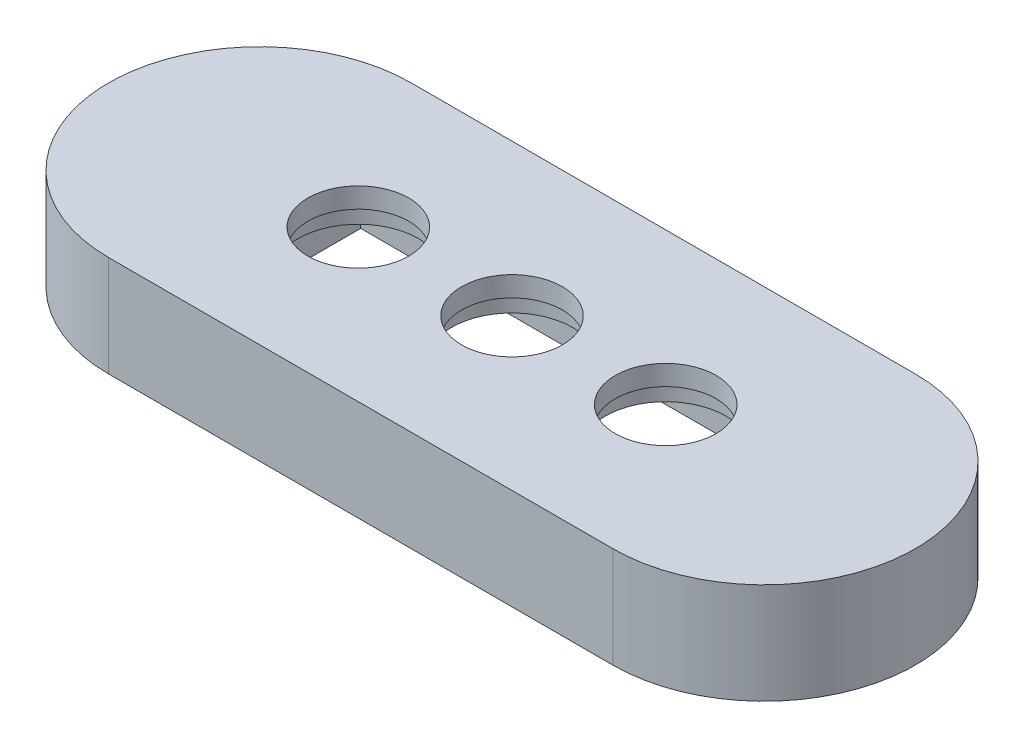
ISO-10303-21;
HEADER;
FILE_DESCRIPTION(('STEP AP214'),'2;1');
FILE_NAME('part.step','',(''),(''),'','','');
FILE_SCHEMA(('AUTOMOTIVE_DESIGN { 1 0 10303 214 1 1 1 1 }'));
ENDSEC;
DATA;
#1=APPLICATION_CONTEXT('core data for automotive mechanical design processes');
#2=APPLICATION_PROTOCOL_DEFINITION('international standard','automotive_design',2000,#1);
#3=PRODUCT_CONTEXT('',#1,'mechanical');
#4=PRODUCT('Part','Part','',(#3));
#5=PRODUCT_RELATED_PRODUCT_CATEGORY('part','',(#4));
#6=PRODUCT_DEFINITION_FORMATION('','',#4);
#7=PRODUCT_DEFINITION_CONTEXT('part definition',#1,'design');
#8=PRODUCT_DEFINITION('design','',#6,#7);
#9=PRODUCT_DEFINITION_SHAPE('','',#8);
#10=(LENGTH_UNIT() NAMED_UNIT(*) SI_UNIT(.MILLI.,.METRE.));
#11=(NAMED_UNIT(*) PLANE_ANGLE_UNIT() SI_UNIT($,.RADIAN.));
#12=(NAMED_UNIT(*) SI_UNIT($,.STERADIAN.) SOLID_ANGLE_UNIT());
#13=UNCERTAINTY_MEASURE_WITH_UNIT(LENGTH_MEASURE(1.E-05),#10,'distance_accuracy_value','');
#14=(GEOMETRIC_REPRESENTATION_CONTEXT(3) GLOBAL_UNCERTAINTY_ASSIGNED_CONTEXT((#13)) GLOBAL_UNIT_ASSIGNED_CONTEXT((#10,
#11,#12)) REPRESENTATION_CONTEXT('',''));
#15=CARTESIAN_POINT('',(0.,0.,0.));
#16=DIRECTION('',(0.,0.,1.));
#17=DIRECTION('',(1.,0.,0.));
#18=AXIS2_PLACEMENT_3D('',#15,#16,#17);
#19=CARTESIAN_POINT('',(0.,-3.,0.));
#20=DIRECTION('',(0.,1.,0.));
#21=DIRECTION('',(0.,0.,1.));
#22=AXIS2_PLACEMENT_3D('',#19,#20,#21);
#23=PLANE('',#22);
#24=DIRECTION('',(0.,0.,-1.));
#25=VECTOR('',#24,1.);
#26=CARTESIAN_POINT('',(0.,-3.,5.));
#27=LINE('',#26,#25);
#28=CARTESIAN_POINT('',(0.,-3.,5.));
#29=VERTEX_POINT('',#28);
#30=CARTESIAN_POINT('',(0.,-3.,-5.));
#31=VERTEX_POINT('',#30);
#32=EDGE_CURVE('E44',#29,#31,#27,.T.);
#33=ORIENTED_EDGE('',*,*,#32,.T.);
#34=DIRECTION('',(-1.,0.,0.));
#35=VECTOR('',#34,1.);
#36=CARTESIAN_POINT('',(-25.,-3.,-5.));
#37=LINE('',#36,#35);
#38=CARTESIAN_POINT('',(-25.,-3.,-5.));
#39=VERTEX_POINT('',#38);
#40=EDGE_CURVE('E11',#31,#39,#37,.T.);
#41=ORIENTED_EDGE('',*,*,#40,.T.);
#42=DIRECTION('',(0.,0.,1.));
#43=VECTOR('',#42,1.);
#44=CARTESIAN_POINT('',(-25.,-3.,5.));
#45=LINE('',#44,#43);
#46=CARTESIAN_POINT('',(-25.,-3.,5.));
#47=VERTEX_POINT('',#46);
#48=EDGE_CURVE('E49',#39,#47,#45,.T.);
#49=ORIENTED_EDGE('',*,*,#48,.T.);
#50=DIRECTION('',(1.,0.,0.));
#51=VECTOR('',#50,1.);
#52=CARTESIAN_POINT('',(-25.,-3.,5.));
#53=LINE('',#52,#51);
#54=EDGE_CURVE('E208',#47,#29,#53,.T.);
#55=ORIENTED_EDGE('',*,*,#54,.T.);
#56=EDGE_LOOP('',(#33,#41,#49,#55));
#57=FACE_BOUND('',#56,.T.);
#58=CARTESIAN_POINT('',(0.,-3.,0.));
#59=DIRECTION('',(0.,1.,0.));
#60=DIRECTION('',(0.,0.,1.));
#61=AXIS2_PLACEMENT_3D('',#58,#59,#60);
#62=CIRCLE('',#61,7.5);
#63=CARTESIAN_POINT('',(0.,-3.,7.5));
#64=VERTEX_POINT('',#63);
#65=CARTESIAN_POINT('',(0.,-3.,-7.5));
#66=VERTEX_POINT('',#65);
#67=EDGE_CURVE('E204',#64,#66,#62,.T.);
#68=ORIENTED_EDGE('',*,*,#67,.F.);
#69=DIRECTION('',(1.,0.,0.));
#70=VECTOR('',#69,1.);
#71=CARTESIAN_POINT('',(0.,-3.,7.5));
#72=LINE('',#71,#70);
#73=CARTESIAN_POINT('',(-25.,-3.,7.5));
#74=VERTEX_POINT('',#73);
#75=EDGE_CURVE('E194',#74,#64,#72,.T.);
#76=ORIENTED_EDGE('',*,*,#75,.F.);
#77=CARTESIAN_POINT('',(-25.,-3.,0.));
#78=DIRECTION('',(0.,1.,0.));
#79=DIRECTION('',(0.,0.,1.));
#80=AXIS2_PLACEMENT_3D('',#77,#78,#79);
#81=CIRCLE('',#80,7.5);
#82=CARTESIAN_POINT('',(-25.,-3.,-7.5));
#83=VERTEX_POINT('',#82);
#84=EDGE_CURVE('E197',#83,#74,#81,.T.);
#85=ORIENTED_EDGE('',*,*,#84,.F.);
#86=DIRECTION('',(-1.,0.,0.));
#87=VECTOR('',#86,1.);
#88=CARTESIAN_POINT('',(0.,-3.,-7.5));
#89=LINE('',#88,#87);
#90=EDGE_CURVE('E200',#66,#83,#89,.T.);
#91=ORIENTED_EDGE('',*,*,#90,.F.);
#92=EDGE_LOOP('',(#68,#76,#85,#91));
#93=FACE_BOUND('',#92,.T.);
#94=ADVANCED_FACE('F41',(#57,#93),#23,.F.);
#95=CARTESIAN_POINT('',(0.,2.,0.));
#96=DIRECTION('',(0.,-1.,0.));
#97=DIRECTION('',(0.,0.,-1.));
#98=AXIS2_PLACEMENT_3D('',#95,#96,#97);
#99=CYLINDRICAL_SURFACE('',#98,7.5);
#100=DIRECTION('',(0.,-1.,0.));
#101=VECTOR('',#100,1.);
#102=CARTESIAN_POINT('',(0.,2.,7.5));
#103=LINE('',#102,#101);
#104=CARTESIAN_POINT('',(0.,2.,7.5));
#105=VERTEX_POINT('',#104);
#106=EDGE_CURVE('E182',#105,#64,#103,.T.);
#107=ORIENTED_EDGE('',*,*,#106,.T.);
#108=ORIENTED_EDGE('',*,*,#67,.T.);
#109=DIRECTION('',(0.,-1.,0.));
#110=VECTOR('',#109,1.);
#111=CARTESIAN_POINT('',(0.,2.,-7.5));
#112=LINE('',#111,#110);
#113=CARTESIAN_POINT('',(0.,2.,-7.5));
#114=VERTEX_POINT('',#113);
#115=EDGE_CURVE('E191',#114,#66,#112,.T.);
#116=ORIENTED_EDGE('',*,*,#115,.F.);
#117=CARTESIAN_POINT('',(0.,2.,0.));
#118=DIRECTION('',(0.,1.,0.));
#119=DIRECTION('',(0.,0.,1.));
#120=AXIS2_PLACEMENT_3D('',#117,#118,#119);
#121=CIRCLE('',#120,7.5);
#122=EDGE_CURVE('E173',#105,#114,#121,.T.);
#123=ORIENTED_EDGE('',*,*,#122,.F.);
#124=EDGE_LOOP('',(#107,#108,#116,#123));
#125=FACE_BOUND('',#124,.T.);
#126=ADVANCED_FACE('F223',(#125),#99,.T.);
#127=CARTESIAN_POINT('',(0.,2.,-7.5));
#128=DIRECTION('',(0.,0.,1.));
#129=DIRECTION('',(1.,0.,0.));
#130=AXIS2_PLACEMENT_3D('',#127,#128,#129);
#131=PLANE('',#130);
#132=ORIENTED_EDGE('',*,*,#115,.T.);
#133=ORIENTED_EDGE('',*,*,#90,.T.);
#134=DIRECTION('',(0.,-1.,0.));
#135=VECTOR('',#134,1.);
#136=CARTESIAN_POINT('',(-25.,2.,-7.5));
#137=LINE('',#136,#135);
#138=CARTESIAN_POINT('',(-25.,2.,-7.5));
#139=VERTEX_POINT('',#138);
#140=EDGE_CURVE('E188',#139,#83,#137,.T.);
#141=ORIENTED_EDGE('',*,*,#140,.F.);
#142=DIRECTION('',(-1.,0.,0.));
#143=VECTOR('',#142,1.);
#144=CARTESIAN_POINT('',(0.,2.,-7.5));
#145=LINE('',#144,#143);
#146=EDGE_CURVE('E176',#114,#139,#145,.T.);
#147=ORIENTED_EDGE('',*,*,#146,.F.);
#148=EDGE_LOOP('',(#132,#133,#141,#147));
#149=FACE_BOUND('',#148,.T.);
#150=ADVANCED_FACE('F229',(#149),#131,.F.);
#151=CARTESIAN_POINT('',(-25.,2.,0.));
#152=DIRECTION('',(0.,-1.,0.));
#153=DIRECTION('',(0.,0.,-1.));
#154=AXIS2_PLACEMENT_3D('',#151,#152,#153);
#155=CYLINDRICAL_SURFACE('',#154,7.5);
#156=ORIENTED_EDGE('',*,*,#140,.T.);
#157=ORIENTED_EDGE('',*,*,#84,.T.);
#158=DIRECTION('',(0.,-1.,0.));
#159=VECTOR('',#158,1.);
#160=CARTESIAN_POINT('',(-25.,2.,7.5));
#161=LINE('',#160,#159);
#162=CARTESIAN_POINT('',(-25.,2.,7.5));
#163=VERTEX_POINT('',#162);
#164=EDGE_CURVE('E185',#163,#74,#161,.T.);
#165=ORIENTED_EDGE('',*,*,#164,.F.);
#166=CARTESIAN_POINT('',(-25.,2.,0.));
#167=DIRECTION('',(0.,1.,0.));
#168=DIRECTION('',(0.,0.,1.));
#169=AXIS2_PLACEMENT_3D('',#166,#167,#168);
#170=CIRCLE('',#169,7.5);
#171=EDGE_CURVE('E178',#139,#163,#170,.T.);
#172=ORIENTED_EDGE('',*,*,#171,.F.);
#173=EDGE_LOOP('',(#156,#157,#165,#172));
#174=FACE_BOUND('',#173,.T.);
#175=ADVANCED_FACE('F275',(#174),#155,.T.);
#176=CARTESIAN_POINT('',(0.,2.,7.5));
#177=DIRECTION('',(0.,0.,-1.));
#178=DIRECTION('',(-1.,0.,0.));
#179=AXIS2_PLACEMENT_3D('',#176,#177,#178);
#180=PLANE('',#179);
#181=ORIENTED_EDGE('',*,*,#164,.T.);
#182=ORIENTED_EDGE('',*,*,#75,.T.);
#183=ORIENTED_EDGE('',*,*,#106,.F.);
#184=DIRECTION('',(1.,0.,0.));
#185=VECTOR('',#184,1.);
#186=CARTESIAN_POINT('',(0.,2.,7.5));
#187=LINE('',#186,#185);
#188=EDGE_CURVE('E180',#163,#105,#187,.T.);
#189=ORIENTED_EDGE('',*,*,#188,.F.);
#190=EDGE_LOOP('',(#181,#182,#183,#189));
#191=FACE_BOUND('',#190,.T.);
#192=ADVANCED_FACE('F272',(#191),#180,.F.);
#193=CARTESIAN_POINT('',(0.,-30.,5.));
#194=DIRECTION('',(-1.,0.,0.));
#195=DIRECTION('',(0.,0.,1.));
#196=AXIS2_PLACEMENT_3D('',#193,#194,#195);
#197=PLANE('',#196);
#198=ORIENTED_EDGE('',*,*,#32,.F.);
#199=DIRECTION('',(0.,1.,0.));
#200=VECTOR('',#199,1.);
#201=CARTESIAN_POINT('',(0.,-30.,5.));
#202=LINE('',#201,#200);
#203=CARTESIAN_POINT('',(0.,0.,5.));
#204=VERTEX_POINT('',#203);
#205=EDGE_CURVE('E106',#29,#204,#202,.T.);
#206=ORIENTED_EDGE('',*,*,#205,.T.);
#207=DIRECTION('',(0.,0.,1.));
#208=VECTOR('',#207,1.);
#209=CARTESIAN_POINT('',(0.,0.,5.));
#210=LINE('',#209,#208);
#211=CARTESIAN_POINT('',(0.,0.,-5.));
#212=VERTEX_POINT('',#211);
#213=EDGE_CURVE('E111',#212,#204,#210,.T.);
#214=ORIENTED_EDGE('',*,*,#213,.F.);
#215=DIRECTION('',(0.,1.,0.));
#216=VECTOR('',#215,1.);
#217=CARTESIAN_POINT('',(0.,-30.,-5.));
#218=LINE('',#217,#216);
#219=EDGE_CURVE('E133',#31,#212,#218,.T.);
#220=ORIENTED_EDGE('',*,*,#219,.F.);
#221=EDGE_LOOP('',(#198,#206,#214,#220));
#222=FACE_BOUND('',#221,.T.);
#223=ADVANCED_FACE('F108',(#222),#197,.T.);
#224=CARTESIAN_POINT('',(-25.,-30.,5.));
#225=DIRECTION('',(0.,0.,-1.));
#226=DIRECTION('',(-1.,0.,0.));
#227=AXIS2_PLACEMENT_3D('',#224,#225,#226);
#228=PLANE('',#227);
#229=ORIENTED_EDGE('',*,*,#54,.F.);
#230=DIRECTION('',(0.,1.,0.));
#231=VECTOR('',#230,1.);
#232=CARTESIAN_POINT('',(-25.,-30.,5.));
#233=LINE('',#232,#231);
#234=CARTESIAN_POINT('',(-25.,0.,5.));
#235=VERTEX_POINT('',#234);
#236=EDGE_CURVE('E115',#47,#235,#233,.T.);
#237=ORIENTED_EDGE('',*,*,#236,.T.);
#238=DIRECTION('',(-1.,0.,0.));
#239=VECTOR('',#238,1.);
#240=CARTESIAN_POINT('',(-25.,0.,5.));
#241=LINE('',#240,#239);
#242=EDGE_CURVE('E118',#204,#235,#241,.T.);
#243=ORIENTED_EDGE('',*,*,#242,.F.);
#244=ORIENTED_EDGE('',*,*,#205,.F.);
#245=EDGE_LOOP('',(#229,#237,#243,#244));
#246=FACE_BOUND('',#245,.T.);
#247=ADVANCED_FACE('F119',(#246),#228,.T.);
#248=CARTESIAN_POINT('',(-25.,-30.,5.));
#249=DIRECTION('',(1.,0.,0.));
#250=DIRECTION('',(0.,0.,-1.));
#251=AXIS2_PLACEMENT_3D('',#248,#249,#250);
#252=PLANE('',#251);
#253=ORIENTED_EDGE('',*,*,#48,.F.);
#254=DIRECTION('',(0.,1.,0.));
#255=VECTOR('',#254,1.);
#256=CARTESIAN_POINT('',(-25.,-30.,-5.));
#257=LINE('',#256,#255);
#258=CARTESIAN_POINT('',(-25.,0.,-5.));
#259=VERTEX_POINT('',#258);
#260=EDGE_CURVE('E135',#39,#259,#257,.T.);
#261=ORIENTED_EDGE('',*,*,#260,.T.);
#262=DIRECTION('',(0.,0.,-1.));
#263=VECTOR('',#262,1.);
#264=CARTESIAN_POINT('',(-25.,0.,5.));
#265=LINE('',#264,#263);
#266=EDGE_CURVE('E123',#235,#259,#265,.T.);
#267=ORIENTED_EDGE('',*,*,#266,.F.);
#268=ORIENTED_EDGE('',*,*,#236,.F.);
#269=EDGE_LOOP('',(#253,#261,#267,#268));
#270=FACE_BOUND('',#269,.T.);
#271=ADVANCED_FACE('F212',(#270),#252,.T.);
#272=CARTESIAN_POINT('',(-25.,-30.,-5.));
#273=DIRECTION('',(0.,0.,1.));
#274=DIRECTION('',(1.,0.,0.));
#275=AXIS2_PLACEMENT_3D('',#272,#273,#274);
#276=PLANE('',#275);
#277=ORIENTED_EDGE('',*,*,#40,.F.);
#278=ORIENTED_EDGE('',*,*,#219,.T.);
#279=DIRECTION('',(1.,0.,0.));
#280=VECTOR('',#279,1.);
#281=CARTESIAN_POINT('',(-25.,0.,-5.));
#282=LINE('',#281,#280);
#283=EDGE_CURVE('E128',#259,#212,#282,.T.);
#284=ORIENTED_EDGE('',*,*,#283,.F.);
#285=ORIENTED_EDGE('',*,*,#260,.F.);
#286=EDGE_LOOP('',(#277,#278,#284,#285));
#287=FACE_BOUND('',#286,.T.);
#288=ADVANCED_FACE('F211',(#287),#276,.T.);
#289=CARTESIAN_POINT('',(-12.5,2.,0.));
#290=DIRECTION('',(0.,-1.,0.));
#291=DIRECTION('',(0.,0.,-1.));
#292=AXIS2_PLACEMENT_3D('',#289,#290,#291);
#293=CYLINDRICAL_SURFACE('',#292,2.5);
#294=CARTESIAN_POINT('',(-12.5,2.,0.));
#295=DIRECTION('',(0.,1.,0.));
#296=DIRECTION('',(0.,0.,1.));
#297=AXIS2_PLACEMENT_3D('',#294,#295,#296);
#298=CIRCLE('',#297,2.5);
#299=CARTESIAN_POINT('',(-12.5,2.,2.5));
#300=VERTEX_POINT('',#299);
#301=EDGE_CURVE('E170',#300,#300,#298,.T.);
#302=ORIENTED_EDGE('',*,*,#301,.T.);
#303=EDGE_LOOP('',(#302));
#304=FACE_BOUND('',#303,.T.);
#305=CARTESIAN_POINT('',(-12.5,1.,0.));
#306=DIRECTION('',(0.,-1.,0.));
#307=DIRECTION('',(0.,0.,-1.));
#308=AXIS2_PLACEMENT_3D('',#305,#306,#307);
#309=CIRCLE('',#308,2.5);
#310=CARTESIAN_POINT('',(-12.5,1.,-2.5));
#311=VERTEX_POINT('',#310);
#312=EDGE_CURVE('E142',#311,#311,#309,.T.);
#313=ORIENTED_EDGE('',*,*,#312,.T.);
#314=EDGE_LOOP('',(#313));
#315=FACE_BOUND('',#314,.T.);
#316=ADVANCED_FACE('F219',(#304,#315),#293,.F.);
#317=CARTESIAN_POINT('',(-20.12,2.,0.));
#318=DIRECTION('',(0.,-1.,0.));
#319=DIRECTION('',(0.,0.,-1.));
#320=AXIS2_PLACEMENT_3D('',#317,#318,#319);
#321=CYLINDRICAL_SURFACE('',#320,2.5);
#322=CARTESIAN_POINT('',(-20.12,2.,0.));
#323=DIRECTION('',(0.,1.,0.));
#324=DIRECTION('',(0.,0.,1.));
#325=AXIS2_PLACEMENT_3D('',#322,#323,#324);
#326=CIRCLE('',#325,2.5);
#327=CARTESIAN_POINT('',(-20.12,2.,2.5));
#328=VERTEX_POINT('',#327);
#329=EDGE_CURVE('E167',#328,#328,#326,.T.);
#330=ORIENTED_EDGE('',*,*,#329,.T.);
#331=EDGE_LOOP('',(#330));
#332=FACE_BOUND('',#331,.T.);
#333=CARTESIAN_POINT('',(-20.12,1.,0.));
#334=DIRECTION('',(0.,-1.,0.));
#335=DIRECTION('',(0.,0.,-1.));
#336=AXIS2_PLACEMENT_3D('',#333,#334,#335);
#337=CIRCLE('',#336,2.5);
#338=CARTESIAN_POINT('',(-20.12,1.,-2.5));
#339=VERTEX_POINT('',#338);
#340=EDGE_CURVE('E138',#339,#339,#337,.T.);
#341=ORIENTED_EDGE('',*,*,#340,.T.);
#342=EDGE_LOOP('',(#341));
#343=FACE_BOUND('',#342,.T.);
#344=ADVANCED_FACE('F259',(#332,#343),#321,.F.);
#345=CARTESIAN_POINT('',(-4.88,2.,0.));
#346=DIRECTION('',(0.,-1.,0.));
#347=DIRECTION('',(0.,0.,-1.));
#348=AXIS2_PLACEMENT_3D('',#345,#346,#347);
#349=CYLINDRICAL_SURFACE('',#348,2.5);
#350=CARTESIAN_POINT('',(-4.88,2.,0.));
#351=DIRECTION('',(0.,1.,0.));
#352=DIRECTION('',(0.,0.,-1.));
#353=AXIS2_PLACEMENT_3D('',#350,#351,#352);
#354=CIRCLE('',#353,2.5);
#355=CARTESIAN_POINT('',(-4.88,2.,-2.5));
#356=VERTEX_POINT('',#355);
#357=EDGE_CURVE('E146',#356,#356,#354,.T.);
#358=ORIENTED_EDGE('',*,*,#357,.T.);
#359=EDGE_LOOP('',(#358));
#360=FACE_BOUND('',#359,.T.);
#361=CARTESIAN_POINT('',(-4.88,1.,0.));
#362=DIRECTION('',(0.,-1.,0.));
#363=DIRECTION('',(0.,0.,-1.));
#364=AXIS2_PLACEMENT_3D('',#361,#362,#363);
#365=CIRCLE('',#364,2.5);
#366=CARTESIAN_POINT('',(-4.88,1.,-2.5));
#367=VERTEX_POINT('',#366);
#368=EDGE_CURVE('E155',#367,#367,#365,.T.);
#369=ORIENTED_EDGE('',*,*,#368,.T.);
#370=EDGE_LOOP('',(#369));
#371=FACE_BOUND('',#370,.T.);
#372=ADVANCED_FACE('F255',(#360,#371),#349,.F.);
#373=CARTESIAN_POINT('',(0.,2.,0.));
#374=DIRECTION('',(0.,1.,0.));
#375=DIRECTION('',(0.,0.,1.));
#376=AXIS2_PLACEMENT_3D('',#373,#374,#375);
#377=PLANE('',#376);
#378=ORIENTED_EDGE('',*,*,#329,.F.);
#379=EDGE_LOOP('',(#378));
#380=FACE_BOUND('',#379,.T.);
#381=ORIENTED_EDGE('',*,*,#122,.T.);
#382=ORIENTED_EDGE('',*,*,#146,.T.);
#383=ORIENTED_EDGE('',*,*,#171,.T.);
#384=ORIENTED_EDGE('',*,*,#188,.T.);
#385=EDGE_LOOP('',(#381,#382,#383,#384));
#386=FACE_BOUND('',#385,.T.);
#387=ORIENTED_EDGE('',*,*,#301,.F.);
#388=EDGE_LOOP('',(#387));
#389=FACE_BOUND('',#388,.T.);
#390=ORIENTED_EDGE('',*,*,#357,.F.);
#391=EDGE_LOOP('',(#390));
#392=FACE_BOUND('',#391,.T.);
#393=ADVANCED_FACE('F258',(#380,#386,#389,#392),#377,.T.);
#394=CARTESIAN_POINT('',(0.,0.,0.));
#395=DIRECTION('',(0.,1.,0.));
#396=DIRECTION('',(0.,0.,1.));
#397=AXIS2_PLACEMENT_3D('',#394,#395,#396);
#398=PLANE('',#397);
#399=ORIENTED_EDGE('',*,*,#283,.T.);
#400=ORIENTED_EDGE('',*,*,#213,.T.);
#401=ORIENTED_EDGE('',*,*,#242,.T.);
#402=ORIENTED_EDGE('',*,*,#266,.T.);
#403=EDGE_LOOP('',(#399,#400,#401,#402));
#404=FACE_BOUND('',#403,.T.);
#405=CARTESIAN_POINT('',(-20.12,0.,0.));
#406=DIRECTION('',(0.,-1.,0.));
#407=DIRECTION('',(0.,0.,-1.));
#408=AXIS2_PLACEMENT_3D('',#405,#406,#407);
#409=CIRCLE('',#408,3.);
#410=CARTESIAN_POINT('',(-20.12,0.,-3.));
#411=VERTEX_POINT('',#410);
#412=EDGE_CURVE('E141',#411,#411,#409,.T.);
#413=ORIENTED_EDGE('',*,*,#412,.F.);
#414=EDGE_LOOP('',(#413));
#415=FACE_BOUND('',#414,.T.);
#416=CARTESIAN_POINT('',(-12.5,0.,0.));
#417=DIRECTION('',(0.,-1.,0.));
#418=DIRECTION('',(0.,0.,-1.));
#419=AXIS2_PLACEMENT_3D('',#416,#417,#418);
#420=CIRCLE('',#419,3.);
#421=CARTESIAN_POINT('',(-12.5,0.,-3.));
#422=VERTEX_POINT('',#421);
#423=EDGE_CURVE('E149',#422,#422,#420,.T.);
#424=ORIENTED_EDGE('',*,*,#423,.F.);
#425=EDGE_LOOP('',(#424));
#426=FACE_BOUND('',#425,.T.);
#427=CARTESIAN_POINT('',(-4.88,0.,0.));
#428=DIRECTION('',(0.,-1.,0.));
#429=DIRECTION('',(0.,0.,-1.));
#430=AXIS2_PLACEMENT_3D('',#427,#428,#429);
#431=CIRCLE('',#430,3.);
#432=CARTESIAN_POINT('',(-4.88,0.,-3.));
#433=VERTEX_POINT('',#432);
#434=EDGE_CURVE('E158',#433,#433,#431,.T.);
#435=ORIENTED_EDGE('',*,*,#434,.F.);
#436=EDGE_LOOP('',(#435));
#437=FACE_BOUND('',#436,.T.);
#438=ADVANCED_FACE('F125',(#404,#415,#426,#437),#398,.F.);
#439=CARTESIAN_POINT('',(-4.88,1.,0.));
#440=DIRECTION('',(0.,-1.,0.));
#441=DIRECTION('',(0.,0.,-1.));
#442=AXIS2_PLACEMENT_3D('',#439,#440,#441);
#443=CYLINDRICAL_SURFACE('',#442,3.);
#444=CARTESIAN_POINT('',(-4.88,1.,0.));
#445=DIRECTION('',(0.,-1.,0.));
#446=DIRECTION('',(0.,0.,-1.));
#447=AXIS2_PLACEMENT_3D('',#444,#445,#446);
#448=CIRCLE('',#447,3.);
#449=CARTESIAN_POINT('',(-4.88,1.,-3.));
#450=VERTEX_POINT('',#449);
#451=EDGE_CURVE('E114',#450,#450,#448,.T.);
#452=ORIENTED_EDGE('',*,*,#451,.F.);
#453=EDGE_LOOP('',(#452));
#454=FACE_BOUND('',#453,.T.);
#455=ORIENTED_EDGE('',*,*,#434,.T.);
#456=EDGE_LOOP('',(#455));
#457=FACE_BOUND('',#456,.T.);
#458=ADVANCED_FACE('F246',(#454,#457),#443,.F.);
#459=CARTESIAN_POINT('',(-4.88,1.,0.));
#460=DIRECTION('',(0.,-1.,0.));
#461=DIRECTION('',(0.,0.,-1.));
#462=AXIS2_PLACEMENT_3D('',#459,#460,#461);
#463=PLANE('',#462);
#464=ORIENTED_EDGE('',*,*,#368,.F.);
#465=EDGE_LOOP('',(#464));
#466=FACE_BOUND('',#465,.T.);
#467=ORIENTED_EDGE('',*,*,#451,.T.);
#468=EDGE_LOOP('',(#467));
#469=FACE_BOUND('',#468,.T.);
#470=ADVANCED_FACE('F249',(#466,#469),#463,.T.);
#471=CARTESIAN_POINT('',(-20.12,1.,0.));
#472=DIRECTION('',(0.,-1.,0.));
#473=DIRECTION('',(0.,0.,-1.));
#474=AXIS2_PLACEMENT_3D('',#471,#472,#473);
#475=CYLINDRICAL_SURFACE('',#474,3.);
#476=CARTESIAN_POINT('',(-20.12,1.,0.));
#477=DIRECTION('',(0.,-1.,0.));
#478=DIRECTION('',(0.,0.,-1.));
#479=AXIS2_PLACEMENT_3D('',#476,#477,#478);
#480=CIRCLE('',#479,3.);
#481=CARTESIAN_POINT('',(-20.12,1.,-3.));
#482=VERTEX_POINT('',#481);
#483=EDGE_CURVE('E143',#482,#482,#480,.T.);
#484=ORIENTED_EDGE('',*,*,#483,.F.);
#485=EDGE_LOOP('',(#484));
#486=FACE_BOUND('',#485,.T.);
#487=ORIENTED_EDGE('',*,*,#412,.T.);
#488=EDGE_LOOP('',(#487));
#489=FACE_BOUND('',#488,.T.);
#490=ADVANCED_FACE('F253',(#486,#489),#475,.F.);
#491=CARTESIAN_POINT('',(-20.12,1.,0.));
#492=DIRECTION('',(0.,-1.,0.));
#493=DIRECTION('',(0.,0.,-1.));
#494=AXIS2_PLACEMENT_3D('',#491,#492,#493);
#495=PLANE('',#494);
#496=ORIENTED_EDGE('',*,*,#340,.F.);
#497=EDGE_LOOP('',(#496));
#498=FACE_BOUND('',#497,.T.);
#499=ORIENTED_EDGE('',*,*,#483,.T.);
#500=EDGE_LOOP('',(#499));
#501=FACE_BOUND('',#500,.T.);
#502=ADVANCED_FACE('F239',(#498,#501),#495,.T.);
#503=CARTESIAN_POINT('',(-12.5,1.,0.));
#504=DIRECTION('',(0.,-1.,0.));
#505=DIRECTION('',(0.,0.,-1.));
#506=AXIS2_PLACEMENT_3D('',#503,#504,#505);
#507=CYLINDRICAL_SURFACE('',#506,3.);
#508=CARTESIAN_POINT('',(-12.5,1.,0.));
#509=DIRECTION('',(0.,-1.,0.));
#510=DIRECTION('',(0.,0.,-1.));
#511=AXIS2_PLACEMENT_3D('',#508,#509,#510);
#512=CIRCLE('',#511,3.);
#513=CARTESIAN_POINT('',(-12.5,1.,-3.));
#514=VERTEX_POINT('',#513);
#515=EDGE_CURVE('E152',#514,#514,#512,.T.);
#516=ORIENTED_EDGE('',*,*,#515,.F.);
#517=EDGE_LOOP('',(#516));
#518=FACE_BOUND('',#517,.T.);
#519=ORIENTED_EDGE('',*,*,#423,.T.);
#520=EDGE_LOOP('',(#519));
#521=FACE_BOUND('',#520,.T.);
#522=ADVANCED_FACE('F232',(#518,#521),#507,.F.);
#523=CARTESIAN_POINT('',(-12.5,1.,0.));
#524=DIRECTION('',(0.,-1.,0.));
#525=DIRECTION('',(0.,0.,-1.));
#526=AXIS2_PLACEMENT_3D('',#523,#524,#525);
#527=PLANE('',#526);
#528=ORIENTED_EDGE('',*,*,#312,.F.);
#529=EDGE_LOOP('',(#528));
#530=FACE_BOUND('',#529,.T.);
#531=ORIENTED_EDGE('',*,*,#515,.T.);
#532=EDGE_LOOP('',(#531));
#533=FACE_BOUND('',#532,.T.);
#534=ADVANCED_FACE('F224',(#530,#533),#527,.T.);
#535=CLOSED_SHELL('',(#94,#126,#150,#175,#192,#223,#247,#271,#288,#316,#344,#372,#393,#438,#458,
#470,#490,#502,#522,#534));
#536=MANIFOLD_SOLID_BREP('B2',#535);
#537=ADVANCED_BREP_SHAPE_REPRESENTATION('',(#18,#536),#14);
#538=SHAPE_DEFINITION_REPRESENTATION(#9,#537);
ENDSEC;
END-ISO-10303-21;
